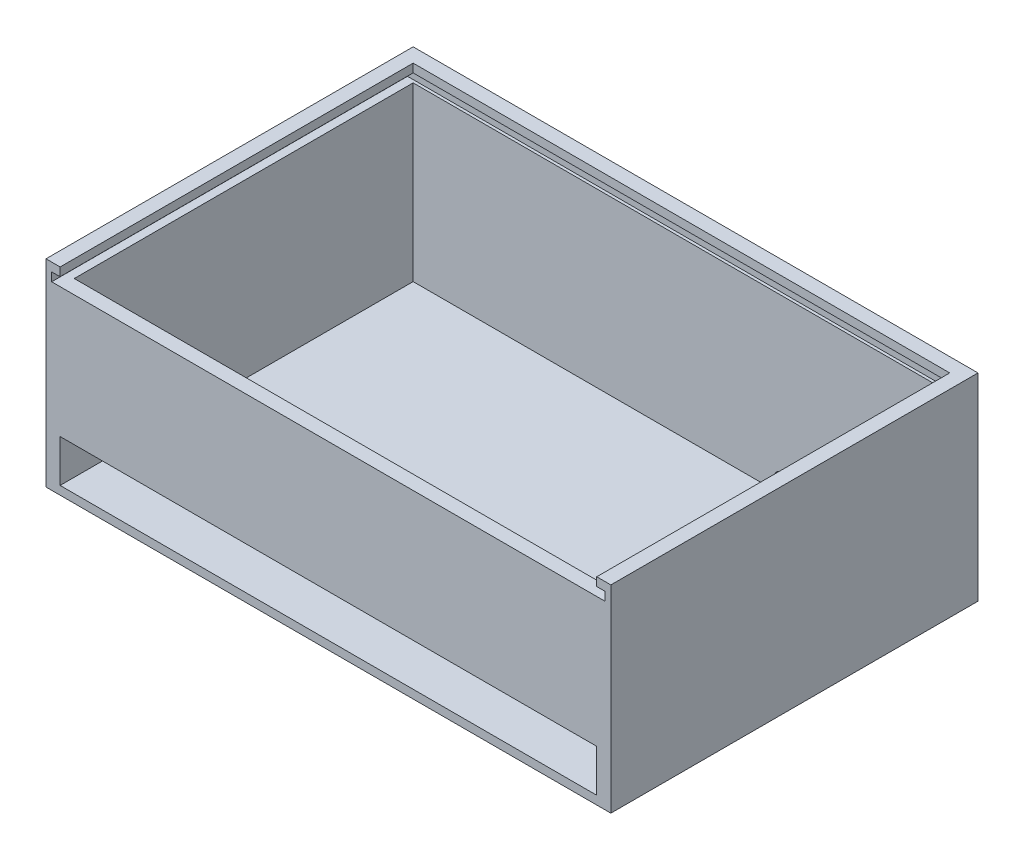
ISO-10303-21;
HEADER;
FILE_DESCRIPTION(('STEP AP214'),'2;1');
FILE_NAME('part.step','',(''),(''),'','','');
FILE_SCHEMA(('AUTOMOTIVE_DESIGN { 1 0 10303 214 1 1 1 1 }'));
ENDSEC;
DATA;
#1=APPLICATION_CONTEXT('core data for automotive mechanical design processes');
#2=APPLICATION_PROTOCOL_DEFINITION('international standard','automotive_design',2000,#1);
#3=PRODUCT_CONTEXT('',#1,'mechanical');
#4=PRODUCT('Part','Part','',(#3));
#5=PRODUCT_RELATED_PRODUCT_CATEGORY('part','',(#4));
#6=PRODUCT_DEFINITION_FORMATION('','',#4);
#7=PRODUCT_DEFINITION_CONTEXT('part definition',#1,'design');
#8=PRODUCT_DEFINITION('design','',#6,#7);
#9=PRODUCT_DEFINITION_SHAPE('','',#8);
#10=(LENGTH_UNIT() NAMED_UNIT(*) SI_UNIT(.MILLI.,.METRE.));
#11=(NAMED_UNIT(*) PLANE_ANGLE_UNIT() SI_UNIT($,.RADIAN.));
#12=(NAMED_UNIT(*) SI_UNIT($,.STERADIAN.) SOLID_ANGLE_UNIT());
#13=UNCERTAINTY_MEASURE_WITH_UNIT(LENGTH_MEASURE(1.E-05),#10,'distance_accuracy_value','');
#14=(GEOMETRIC_REPRESENTATION_CONTEXT(3) GLOBAL_UNCERTAINTY_ASSIGNED_CONTEXT((#13)) GLOBAL_UNIT_ASSIGNED_CONTEXT((#10,
#11,#12)) REPRESENTATION_CONTEXT('',''));
#15=CARTESIAN_POINT('',(0.,0.,0.));
#16=DIRECTION('',(0.,0.,1.));
#17=DIRECTION('',(1.,0.,0.));
#18=AXIS2_PLACEMENT_3D('',#15,#16,#17);
#19=CARTESIAN_POINT('',(-95.,70.,0.));
#20=DIRECTION('',(1.,0.,0.));
#21=DIRECTION('',(0.,0.,-1.));
#22=AXIS2_PLACEMENT_3D('',#19,#20,#21);
#23=PLANE('',#22);
#24=DIRECTION('',(0.,0.,1.));
#25=VECTOR('',#24,1.);
#26=CARTESIAN_POINT('',(-95.,67.,0.));
#27=LINE('',#26,#25);
#28=CARTESIAN_POINT('',(-95.,67.,-60.));
#29=VERTEX_POINT('',#28);
#30=CARTESIAN_POINT('',(-95.,67.,65.));
#31=VERTEX_POINT('',#30);
#32=EDGE_CURVE('E63',#29,#31,#27,.T.);
#33=ORIENTED_EDGE('',*,*,#32,.F.);
#34=DIRECTION('',(0.,-1.,0.));
#35=VECTOR('',#34,1.);
#36=CARTESIAN_POINT('',(-95.,70.,-60.));
#37=LINE('',#36,#35);
#38=CARTESIAN_POINT('',(-95.,70.,-60.));
#39=VERTEX_POINT('',#38);
#40=EDGE_CURVE('E312',#39,#29,#37,.T.);
#41=ORIENTED_EDGE('',*,*,#40,.F.);
#42=DIRECTION('',(0.,0.,1.));
#43=VECTOR('',#42,1.);
#44=CARTESIAN_POINT('',(-95.,70.,0.));
#45=LINE('',#44,#43);
#46=CARTESIAN_POINT('',(-95.,70.,65.));
#47=VERTEX_POINT('',#46);
#48=EDGE_CURVE('E283',#39,#47,#45,.T.);
#49=ORIENTED_EDGE('',*,*,#48,.T.);
#50=DIRECTION('',(0.,-1.,0.));
#51=VECTOR('',#50,1.);
#52=CARTESIAN_POINT('',(-95.,70.,65.));
#53=LINE('',#52,#51);
#54=EDGE_CURVE('E195',#47,#31,#53,.T.);
#55=ORIENTED_EDGE('',*,*,#54,.T.);
#56=EDGE_LOOP('',(#33,#41,#49,#55));
#57=FACE_BOUND('',#56,.T.);
#58=ADVANCED_FACE('F47',(#57),#23,.T.);
#59=CARTESIAN_POINT('',(0.,70.,-60.));
#60=DIRECTION('',(0.,0.,-1.));
#61=DIRECTION('',(-1.,0.,0.));
#62=AXIS2_PLACEMENT_3D('',#59,#60,#61);
#63=PLANE('',#62);
#64=ORIENTED_EDGE('',*,*,#40,.T.);
#65=DIRECTION('',(1.,0.,0.));
#66=VECTOR('',#65,1.);
#67=CARTESIAN_POINT('',(0.,67.,-60.));
#68=LINE('',#67,#66);
#69=CARTESIAN_POINT('',(95.,67.,-60.));
#70=VERTEX_POINT('',#69);
#71=EDGE_CURVE('E183',#29,#70,#68,.T.);
#72=ORIENTED_EDGE('',*,*,#71,.T.);
#73=DIRECTION('',(0.,-1.,0.));
#74=VECTOR('',#73,1.);
#75=CARTESIAN_POINT('',(95.,70.,-60.));
#76=LINE('',#75,#74);
#77=CARTESIAN_POINT('',(95.,70.,-60.));
#78=VERTEX_POINT('',#77);
#79=EDGE_CURVE('E179',#78,#70,#76,.T.);
#80=ORIENTED_EDGE('',*,*,#79,.F.);
#81=DIRECTION('',(1.,0.,0.));
#82=VECTOR('',#81,1.);
#83=CARTESIAN_POINT('',(0.,70.,-60.));
#84=LINE('',#83,#82);
#85=EDGE_CURVE('E286',#39,#78,#84,.T.);
#86=ORIENTED_EDGE('',*,*,#85,.F.);
#87=EDGE_LOOP('',(#64,#72,#80,#86));
#88=FACE_BOUND('',#87,.T.);
#89=ADVANCED_FACE('F402',(#88),#63,.F.);
#90=CARTESIAN_POINT('',(95.,70.,0.));
#91=DIRECTION('',(1.,0.,0.));
#92=DIRECTION('',(0.,0.,-1.));
#93=AXIS2_PLACEMENT_3D('',#90,#91,#92);
#94=PLANE('',#93);
#95=ORIENTED_EDGE('',*,*,#79,.T.);
#96=DIRECTION('',(0.,0.,1.));
#97=VECTOR('',#96,1.);
#98=CARTESIAN_POINT('',(95.,67.,0.));
#99=LINE('',#98,#97);
#100=CARTESIAN_POINT('',(95.,67.,65.));
#101=VERTEX_POINT('',#100);
#102=EDGE_CURVE('E173',#70,#101,#99,.T.);
#103=ORIENTED_EDGE('',*,*,#102,.T.);
#104=DIRECTION('',(0.,1.,0.));
#105=VECTOR('',#104,1.);
#106=CARTESIAN_POINT('',(95.,70.,65.));
#107=LINE('',#106,#105);
#108=CARTESIAN_POINT('',(95.,70.,65.));
#109=VERTEX_POINT('',#108);
#110=EDGE_CURVE('E176',#101,#109,#107,.T.);
#111=ORIENTED_EDGE('',*,*,#110,.T.);
#112=DIRECTION('',(0.,0.,1.));
#113=VECTOR('',#112,1.);
#114=CARTESIAN_POINT('',(95.,70.,0.));
#115=LINE('',#114,#113);
#116=EDGE_CURVE('E290',#78,#109,#115,.T.);
#117=ORIENTED_EDGE('',*,*,#116,.F.);
#118=EDGE_LOOP('',(#95,#103,#111,#117));
#119=FACE_BOUND('',#118,.T.);
#120=ADVANCED_FACE('F175',(#119),#94,.F.);
#121=CARTESIAN_POINT('',(100.,3.,-65.));
#122=DIRECTION('',(-1.,0.,0.));
#123=DIRECTION('',(0.,0.,1.));
#124=AXIS2_PLACEMENT_3D('',#121,#122,#123);
#125=PLANE('',#124);
#126=DIRECTION('',(0.,0.,-1.));
#127=VECTOR('',#126,1.);
#128=CARTESIAN_POINT('',(100.,0.,-65.));
#129=LINE('',#128,#127);
#130=CARTESIAN_POINT('',(100.,0.,65.));
#131=VERTEX_POINT('',#130);
#132=CARTESIAN_POINT('',(100.,0.,-65.));
#133=VERTEX_POINT('',#132);
#134=EDGE_CURVE('E316',#131,#133,#129,.T.);
#135=ORIENTED_EDGE('',*,*,#134,.T.);
#136=DIRECTION('',(0.,-1.,0.));
#137=VECTOR('',#136,1.);
#138=CARTESIAN_POINT('',(100.,3.,-65.));
#139=LINE('',#138,#137);
#140=CARTESIAN_POINT('',(100.,70.,-65.));
#141=VERTEX_POINT('',#140);
#142=EDGE_CURVE('E56',#141,#133,#139,.T.);
#143=ORIENTED_EDGE('',*,*,#142,.F.);
#144=DIRECTION('',(0.,0.,-1.));
#145=VECTOR('',#144,1.);
#146=CARTESIAN_POINT('',(100.,70.,0.));
#147=LINE('',#146,#145);
#148=CARTESIAN_POINT('',(100.,70.,65.));
#149=VERTEX_POINT('',#148);
#150=EDGE_CURVE('E271',#149,#141,#147,.T.);
#151=ORIENTED_EDGE('',*,*,#150,.F.);
#152=DIRECTION('',(0.,-1.,0.));
#153=VECTOR('',#152,1.);
#154=CARTESIAN_POINT('',(100.,3.,65.));
#155=LINE('',#154,#153);
#156=EDGE_CURVE('E329',#149,#131,#155,.T.);
#157=ORIENTED_EDGE('',*,*,#156,.T.);
#158=EDGE_LOOP('',(#135,#143,#151,#157));
#159=FACE_BOUND('',#158,.T.);
#160=ADVANCED_FACE('F49',(#159),#125,.F.);
#161=CARTESIAN_POINT('',(-100.,3.,-65.));
#162=DIRECTION('',(0.,0.,1.));
#163=DIRECTION('',(1.,0.,0.));
#164=AXIS2_PLACEMENT_3D('',#161,#162,#163);
#165=PLANE('',#164);
#166=CARTESIAN_POINT('',(35.,7.50000000000001,-65.));
#167=DIRECTION('',(0.,0.,-1.));
#168=DIRECTION('',(-1.,0.,0.));
#169=AXIS2_PLACEMENT_3D('',#166,#167,#168);
#170=CIRCLE('',#169,2.);
#171=CARTESIAN_POINT('',(33.,7.50000000000001,-65.));
#172=VERTEX_POINT('',#171);
#173=EDGE_CURVE('E469',#172,#172,#170,.T.);
#174=ORIENTED_EDGE('',*,*,#173,.F.);
#175=EDGE_LOOP('',(#174));
#176=FACE_BOUND('',#175,.T.);
#177=DIRECTION('',(-1.,0.,0.));
#178=VECTOR('',#177,1.);
#179=CARTESIAN_POINT('',(-100.,0.,-65.));
#180=LINE('',#179,#178);
#181=CARTESIAN_POINT('',(-100.,0.,-65.));
#182=VERTEX_POINT('',#181);
#183=EDGE_CURVE('E320',#133,#182,#180,.T.);
#184=ORIENTED_EDGE('',*,*,#183,.T.);
#185=DIRECTION('',(0.,-1.,0.));
#186=VECTOR('',#185,1.);
#187=CARTESIAN_POINT('',(-100.,3.,-65.));
#188=LINE('',#187,#186);
#189=CARTESIAN_POINT('',(-100.,70.,-65.));
#190=VERTEX_POINT('',#189);
#191=EDGE_CURVE('E337',#190,#182,#188,.T.);
#192=ORIENTED_EDGE('',*,*,#191,.F.);
#193=DIRECTION('',(-1.,0.,0.));
#194=VECTOR('',#193,1.);
#195=CARTESIAN_POINT('',(0.,70.,-65.));
#196=LINE('',#195,#194);
#197=EDGE_CURVE('E275',#141,#190,#196,.T.);
#198=ORIENTED_EDGE('',*,*,#197,.F.);
#199=ORIENTED_EDGE('',*,*,#142,.T.);
#200=EDGE_LOOP('',(#184,#192,#198,#199));
#201=FACE_BOUND('',#200,.T.);
#202=ADVANCED_FACE('F344',(#176,#201),#165,.F.);
#203=CARTESIAN_POINT('',(-100.,3.,-65.));
#204=DIRECTION('',(1.,0.,0.));
#205=DIRECTION('',(0.,0.,-1.));
#206=AXIS2_PLACEMENT_3D('',#203,#204,#205);
#207=PLANE('',#206);
#208=DIRECTION('',(0.,0.,1.));
#209=VECTOR('',#208,1.);
#210=CARTESIAN_POINT('',(-100.,0.,-65.));
#211=LINE('',#210,#209);
#212=CARTESIAN_POINT('',(-100.,0.,65.));
#213=VERTEX_POINT('',#212);
#214=EDGE_CURVE('E323',#182,#213,#211,.T.);
#215=ORIENTED_EDGE('',*,*,#214,.T.);
#216=DIRECTION('',(0.,-1.,0.));
#217=VECTOR('',#216,1.);
#218=CARTESIAN_POINT('',(-100.,3.,65.));
#219=LINE('',#218,#217);
#220=CARTESIAN_POINT('',(-100.,70.,65.));
#221=VERTEX_POINT('',#220);
#222=EDGE_CURVE('E333',#221,#213,#219,.T.);
#223=ORIENTED_EDGE('',*,*,#222,.F.);
#224=DIRECTION('',(0.,0.,1.));
#225=VECTOR('',#224,1.);
#226=CARTESIAN_POINT('',(-100.,70.,0.));
#227=LINE('',#226,#225);
#228=EDGE_CURVE('E279',#190,#221,#227,.T.);
#229=ORIENTED_EDGE('',*,*,#228,.F.);
#230=ORIENTED_EDGE('',*,*,#191,.T.);
#231=EDGE_LOOP('',(#215,#223,#229,#230));
#232=FACE_BOUND('',#231,.T.);
#233=ADVANCED_FACE('F353',(#232),#207,.F.);
#234=CARTESIAN_POINT('',(-100.,3.,65.));
#235=DIRECTION('',(0.,0.,-1.));
#236=DIRECTION('',(-1.,0.,0.));
#237=AXIS2_PLACEMENT_3D('',#234,#235,#236);
#238=PLANE('',#237);
#239=DIRECTION('',(1.,0.,0.));
#240=VECTOR('',#239,1.);
#241=CARTESIAN_POINT('',(0.,70.,65.));
#242=LINE('',#241,#240);
#243=EDGE_CURVE('E193',#109,#149,#242,.T.);
#244=ORIENTED_EDGE('',*,*,#243,.F.);
#245=ORIENTED_EDGE('',*,*,#110,.F.);
#246=DIRECTION('',(-1.,0.,0.));
#247=VECTOR('',#246,1.);
#248=CARTESIAN_POINT('',(-98.,67.,65.));
#249=LINE('',#248,#247);
#250=CARTESIAN_POINT('',(98.,67.,65.));
#251=VERTEX_POINT('',#250);
#252=EDGE_CURVE('E191',#251,#101,#249,.T.);
#253=ORIENTED_EDGE('',*,*,#252,.F.);
#254=DIRECTION('',(0.,1.,0.));
#255=VECTOR('',#254,1.);
#256=CARTESIAN_POINT('',(98.,67.,65.));
#257=LINE('',#256,#255);
#258=CARTESIAN_POINT('',(98.,63.95,65.));
#259=VERTEX_POINT('',#258);
#260=EDGE_CURVE('E210',#259,#251,#257,.T.);
#261=ORIENTED_EDGE('',*,*,#260,.F.);
#262=DIRECTION('',(1.,0.,0.));
#263=VECTOR('',#262,1.);
#264=CARTESIAN_POINT('',(-98.,63.95,65.));
#265=LINE('',#264,#263);
#266=CARTESIAN_POINT('',(-98.,63.95,65.));
#267=VERTEX_POINT('',#266);
#268=EDGE_CURVE('E376',#267,#259,#265,.T.);
#269=ORIENTED_EDGE('',*,*,#268,.F.);
#270=DIRECTION('',(0.,-1.,0.));
#271=VECTOR('',#270,1.);
#272=CARTESIAN_POINT('',(-98.,67.,65.));
#273=LINE('',#272,#271);
#274=CARTESIAN_POINT('',(-98.,67.,65.));
#275=VERTEX_POINT('',#274);
#276=EDGE_CURVE('E71',#275,#267,#273,.T.);
#277=ORIENTED_EDGE('',*,*,#276,.F.);
#278=EDGE_CURVE('E203',#31,#275,#249,.T.);
#279=ORIENTED_EDGE('',*,*,#278,.F.);
#280=ORIENTED_EDGE('',*,*,#54,.F.);
#281=EDGE_CURVE('E267',#221,#47,#242,.T.);
#282=ORIENTED_EDGE('',*,*,#281,.F.);
#283=ORIENTED_EDGE('',*,*,#222,.T.);
#284=DIRECTION('',(1.,0.,0.));
#285=VECTOR('',#284,1.);
#286=CARTESIAN_POINT('',(-100.,0.,65.));
#287=LINE('',#286,#285);
#288=EDGE_CURVE('E326',#213,#131,#287,.T.);
#289=ORIENTED_EDGE('',*,*,#288,.T.);
#290=ORIENTED_EDGE('',*,*,#156,.F.);
#291=EDGE_LOOP('',(#244,#245,#253,#261,#269,#277,#279,#280,#282,#283,#289,#290));
#292=FACE_BOUND('',#291,.T.);
#293=DIRECTION('',(0.,1.,0.));
#294=VECTOR('',#293,1.);
#295=CARTESIAN_POINT('',(95.,3.,65.));
#296=LINE('',#295,#294);
#297=CARTESIAN_POINT('',(95.,3.,65.));
#298=VERTEX_POINT('',#297);
#299=CARTESIAN_POINT('',(95.,18.,65.));
#300=VERTEX_POINT('',#299);
#301=EDGE_CURVE('E245',#298,#300,#296,.T.);
#302=ORIENTED_EDGE('',*,*,#301,.F.);
#303=DIRECTION('',(1.,0.,0.));
#304=VECTOR('',#303,1.);
#305=CARTESIAN_POINT('',(-95.,3.,65.));
#306=LINE('',#305,#304);
#307=CARTESIAN_POINT('',(-95.,3.,65.));
#308=VERTEX_POINT('',#307);
#309=EDGE_CURVE('E249',#308,#298,#306,.T.);
#310=ORIENTED_EDGE('',*,*,#309,.F.);
#311=DIRECTION('',(0.,-1.,0.));
#312=VECTOR('',#311,1.);
#313=CARTESIAN_POINT('',(-95.,3.,65.));
#314=LINE('',#313,#312);
#315=CARTESIAN_POINT('',(-95.,18.,65.));
#316=VERTEX_POINT('',#315);
#317=EDGE_CURVE('E240',#316,#308,#314,.T.);
#318=ORIENTED_EDGE('',*,*,#317,.F.);
#319=DIRECTION('',(-1.,0.,0.));
#320=VECTOR('',#319,1.);
#321=CARTESIAN_POINT('',(-95.,18.,65.));
#322=LINE('',#321,#320);
#323=EDGE_CURVE('E241',#300,#316,#322,.T.);
#324=ORIENTED_EDGE('',*,*,#323,.F.);
#325=EDGE_LOOP('',(#302,#310,#318,#324));
#326=FACE_BOUND('',#325,.T.);
#327=ADVANCED_FACE('F188',(#292,#326),#238,.F.);
#328=CARTESIAN_POINT('',(0.,0.,0.));
#329=DIRECTION('',(0.,1.,0.));
#330=DIRECTION('',(0.,0.,1.));
#331=AXIS2_PLACEMENT_3D('',#328,#329,#330);
#332=PLANE('',#331);
#333=ORIENTED_EDGE('',*,*,#134,.F.);
#334=ORIENTED_EDGE('',*,*,#288,.F.);
#335=ORIENTED_EDGE('',*,*,#214,.F.);
#336=ORIENTED_EDGE('',*,*,#183,.F.);
#337=EDGE_LOOP('',(#333,#334,#335,#336));
#338=FACE_BOUND('',#337,.T.);
#339=ADVANCED_FACE('F350',(#338),#332,.F.);
#340=DIRECTION('',(0.,0.,-1.));
#341=VECTOR('',#340,1.);
#342=CARTESIAN_POINT('',(-95.,63.95,0.));
#343=LINE('',#342,#341);
#344=CARTESIAN_POINT('',(-95.,63.95,60.));
#345=VERTEX_POINT('',#344);
#346=CARTESIAN_POINT('',(-95.,63.95,-60.));
#347=VERTEX_POINT('',#346);
#348=EDGE_CURVE('E184',#345,#347,#343,.T.);
#349=ORIENTED_EDGE('',*,*,#348,.F.);
#350=DIRECTION('',(0.,-1.,0.));
#351=VECTOR('',#350,1.);
#352=CARTESIAN_POINT('',(-95.,70.,60.));
#353=LINE('',#352,#351);
#354=CARTESIAN_POINT('',(-95.,18.,60.));
#355=VERTEX_POINT('',#354);
#356=EDGE_CURVE('E293',#345,#355,#353,.T.);
#357=ORIENTED_EDGE('',*,*,#356,.T.);
#358=DIRECTION('',(0.,0.,1.));
#359=VECTOR('',#358,1.);
#360=CARTESIAN_POINT('',(-95.,18.,-130.591185525459));
#361=LINE('',#360,#359);
#362=EDGE_CURVE('E260',#355,#316,#361,.T.);
#363=ORIENTED_EDGE('',*,*,#362,.T.);
#364=ORIENTED_EDGE('',*,*,#317,.T.);
#365=DIRECTION('',(0.,0.,1.));
#366=VECTOR('',#365,1.);
#367=CARTESIAN_POINT('',(-95.,3.,0.));
#368=LINE('',#367,#366);
#369=CARTESIAN_POINT('',(-95.,3.,-60.));
#370=VERTEX_POINT('',#369);
#371=EDGE_CURVE('E264',#370,#308,#368,.T.);
#372=ORIENTED_EDGE('',*,*,#371,.F.);
#373=EDGE_CURVE('E311',#347,#370,#37,.T.);
#374=ORIENTED_EDGE('',*,*,#373,.F.);
#375=EDGE_LOOP('',(#349,#357,#363,#364,#372,#374));
#376=FACE_BOUND('',#375,.T.);
#377=ADVANCED_FACE('F405',(#376),#23,.T.);
#378=CARTESIAN_POINT('',(35.,7.50000000000001,-60.));
#379=DIRECTION('',(0.,0.,-1.));
#380=DIRECTION('',(-1.,0.,0.));
#381=AXIS2_PLACEMENT_3D('',#378,#379,#380);
#382=CIRCLE('',#381,2.);
#383=CARTESIAN_POINT('',(33.,7.50000000000001,-60.));
#384=VERTEX_POINT('',#383);
#385=EDGE_CURVE('E472',#384,#384,#382,.F.);
#386=ORIENTED_EDGE('',*,*,#385,.F.);
#387=EDGE_LOOP('',(#386));
#388=FACE_BOUND('',#387,.T.);
#389=CARTESIAN_POINT('',(95.,63.95,-60.));
#390=VERTEX_POINT('',#389);
#391=CARTESIAN_POINT('',(95.,3.,-60.));
#392=VERTEX_POINT('',#391);
#393=EDGE_CURVE('E308',#390,#392,#76,.T.);
#394=ORIENTED_EDGE('',*,*,#393,.F.);
#395=DIRECTION('',(-1.,0.,0.));
#396=VECTOR('',#395,1.);
#397=CARTESIAN_POINT('',(0.,63.95,-60.));
#398=LINE('',#397,#396);
#399=EDGE_CURVE('E230',#390,#347,#398,.T.);
#400=ORIENTED_EDGE('',*,*,#399,.T.);
#401=ORIENTED_EDGE('',*,*,#373,.T.);
#402=DIRECTION('',(1.,0.,0.));
#403=VECTOR('',#402,1.);
#404=CARTESIAN_POINT('',(0.,3.,-60.));
#405=LINE('',#404,#403);
#406=EDGE_CURVE('E296',#370,#392,#405,.T.);
#407=ORIENTED_EDGE('',*,*,#406,.T.);
#408=EDGE_LOOP('',(#394,#400,#401,#407));
#409=FACE_BOUND('',#408,.T.);
#410=ADVANCED_FACE('F412',(#388,#409),#63,.F.);
#411=DIRECTION('',(0.,-1.,0.));
#412=VECTOR('',#411,1.);
#413=CARTESIAN_POINT('',(95.,70.,60.));
#414=LINE('',#413,#412);
#415=CARTESIAN_POINT('',(95.,63.95,60.));
#416=VERTEX_POINT('',#415);
#417=CARTESIAN_POINT('',(95.,18.,60.));
#418=VERTEX_POINT('',#417);
#419=EDGE_CURVE('E305',#416,#418,#414,.T.);
#420=ORIENTED_EDGE('',*,*,#419,.F.);
#421=DIRECTION('',(0.,0.,-1.));
#422=VECTOR('',#421,1.);
#423=CARTESIAN_POINT('',(95.,63.95,0.));
#424=LINE('',#423,#422);
#425=EDGE_CURVE('E217',#416,#390,#424,.T.);
#426=ORIENTED_EDGE('',*,*,#425,.T.);
#427=ORIENTED_EDGE('',*,*,#393,.T.);
#428=DIRECTION('',(0.,0.,1.));
#429=VECTOR('',#428,1.);
#430=CARTESIAN_POINT('',(95.,3.,0.));
#431=LINE('',#430,#429);
#432=EDGE_CURVE('E300',#392,#298,#431,.T.);
#433=ORIENTED_EDGE('',*,*,#432,.T.);
#434=ORIENTED_EDGE('',*,*,#301,.T.);
#435=DIRECTION('',(0.,0.,1.));
#436=VECTOR('',#435,1.);
#437=CARTESIAN_POINT('',(95.,18.,-130.591185525459));
#438=LINE('',#437,#436);
#439=EDGE_CURVE('E244',#418,#300,#438,.T.);
#440=ORIENTED_EDGE('',*,*,#439,.F.);
#441=EDGE_LOOP('',(#420,#426,#427,#433,#434,#440));
#442=FACE_BOUND('',#441,.T.);
#443=ADVANCED_FACE('F420',(#442),#94,.F.);
#444=CARTESIAN_POINT('',(0.,70.,60.));
#445=DIRECTION('',(0.,0.,-1.));
#446=DIRECTION('',(-1.,0.,0.));
#447=AXIS2_PLACEMENT_3D('',#444,#445,#446);
#448=PLANE('',#447);
#449=DIRECTION('',(-1.,0.,0.));
#450=VECTOR('',#449,1.);
#451=CARTESIAN_POINT('',(0.,63.95,60.));
#452=LINE('',#451,#450);
#453=EDGE_CURVE('E11',#416,#345,#452,.T.);
#454=ORIENTED_EDGE('',*,*,#453,.F.);
#455=ORIENTED_EDGE('',*,*,#419,.T.);
#456=DIRECTION('',(-1.,0.,0.));
#457=VECTOR('',#456,1.);
#458=CARTESIAN_POINT('',(-95.,18.,60.));
#459=LINE('',#458,#457);
#460=EDGE_CURVE('E256',#418,#355,#459,.T.);
#461=ORIENTED_EDGE('',*,*,#460,.T.);
#462=ORIENTED_EDGE('',*,*,#356,.F.);
#463=EDGE_LOOP('',(#454,#455,#461,#462));
#464=FACE_BOUND('',#463,.T.);
#465=ADVANCED_FACE('F431',(#464),#448,.T.);
#466=CARTESIAN_POINT('',(0.,70.,0.));
#467=DIRECTION('',(0.,1.,0.));
#468=DIRECTION('',(0.,0.,1.));
#469=AXIS2_PLACEMENT_3D('',#466,#467,#468);
#470=PLANE('',#469);
#471=ORIENTED_EDGE('',*,*,#116,.T.);
#472=ORIENTED_EDGE('',*,*,#243,.T.);
#473=ORIENTED_EDGE('',*,*,#150,.T.);
#474=ORIENTED_EDGE('',*,*,#197,.T.);
#475=ORIENTED_EDGE('',*,*,#228,.T.);
#476=ORIENTED_EDGE('',*,*,#281,.T.);
#477=ORIENTED_EDGE('',*,*,#48,.F.);
#478=ORIENTED_EDGE('',*,*,#85,.T.);
#479=EDGE_LOOP('',(#471,#472,#473,#474,#475,#476,#477,#478));
#480=FACE_BOUND('',#479,.T.);
#481=ADVANCED_FACE('F360',(#480),#470,.T.);
#482=CARTESIAN_POINT('',(0.,3.,0.));
#483=DIRECTION('',(0.,1.,0.));
#484=DIRECTION('',(0.,0.,1.));
#485=AXIS2_PLACEMENT_3D('',#482,#483,#484);
#486=PLANE('',#485);
#487=ORIENTED_EDGE('',*,*,#371,.T.);
#488=ORIENTED_EDGE('',*,*,#309,.T.);
#489=ORIENTED_EDGE('',*,*,#432,.F.);
#490=ORIENTED_EDGE('',*,*,#406,.F.);
#491=EDGE_LOOP('',(#487,#488,#489,#490));
#492=FACE_BOUND('',#491,.T.);
#493=ADVANCED_FACE('F444',(#492),#486,.T.);
#494=CARTESIAN_POINT('',(-95.,18.,-130.591185525459));
#495=DIRECTION('',(0.,1.,0.));
#496=DIRECTION('',(0.,0.,1.));
#497=AXIS2_PLACEMENT_3D('',#494,#495,#496);
#498=PLANE('',#497);
#499=ORIENTED_EDGE('',*,*,#439,.T.);
#500=ORIENTED_EDGE('',*,*,#323,.T.);
#501=ORIENTED_EDGE('',*,*,#362,.F.);
#502=ORIENTED_EDGE('',*,*,#460,.F.);
#503=EDGE_LOOP('',(#499,#500,#501,#502));
#504=FACE_BOUND('',#503,.T.);
#505=ADVANCED_FACE('F436',(#504),#498,.F.);
#506=CARTESIAN_POINT('',(-98.,67.,-61.));
#507=DIRECTION('',(-1.,0.,0.));
#508=DIRECTION('',(0.,0.,1.));
#509=AXIS2_PLACEMENT_3D('',#506,#507,#508);
#510=PLANE('',#509);
#511=ORIENTED_EDGE('',*,*,#276,.T.);
#512=DIRECTION('',(0.,0.,1.));
#513=VECTOR('',#512,1.);
#514=CARTESIAN_POINT('',(-98.,63.95,-61.));
#515=LINE('',#514,#513);
#516=CARTESIAN_POINT('',(-98.,63.95,-61.));
#517=VERTEX_POINT('',#516);
#518=EDGE_CURVE('E223',#517,#267,#515,.T.);
#519=ORIENTED_EDGE('',*,*,#518,.F.);
#520=DIRECTION('',(0.,-1.,0.));
#521=VECTOR('',#520,1.);
#522=CARTESIAN_POINT('',(-98.,67.,-61.));
#523=LINE('',#522,#521);
#524=CARTESIAN_POINT('',(-98.,67.,-61.));
#525=VERTEX_POINT('',#524);
#526=EDGE_CURVE('E202',#525,#517,#523,.T.);
#527=ORIENTED_EDGE('',*,*,#526,.F.);
#528=DIRECTION('',(0.,0.,1.));
#529=VECTOR('',#528,1.);
#530=CARTESIAN_POINT('',(-98.,67.,-61.));
#531=LINE('',#530,#529);
#532=EDGE_CURVE('E214',#525,#275,#531,.T.);
#533=ORIENTED_EDGE('',*,*,#532,.T.);
#534=EDGE_LOOP('',(#511,#519,#527,#533));
#535=FACE_BOUND('',#534,.T.);
#536=ADVANCED_FACE('F386',(#535),#510,.F.);
#537=CARTESIAN_POINT('',(-98.,67.,-61.));
#538=DIRECTION('',(0.,1.,0.));
#539=DIRECTION('',(0.,0.,1.));
#540=AXIS2_PLACEMENT_3D('',#537,#538,#539);
#541=PLANE('',#540);
#542=ORIENTED_EDGE('',*,*,#252,.T.);
#543=ORIENTED_EDGE('',*,*,#102,.F.);
#544=ORIENTED_EDGE('',*,*,#71,.F.);
#545=ORIENTED_EDGE('',*,*,#32,.T.);
#546=ORIENTED_EDGE('',*,*,#278,.T.);
#547=ORIENTED_EDGE('',*,*,#532,.F.);
#548=DIRECTION('',(-1.,0.,0.));
#549=VECTOR('',#548,1.);
#550=CARTESIAN_POINT('',(-98.,67.,-61.));
#551=LINE('',#550,#549);
#552=CARTESIAN_POINT('',(98.,67.,-61.));
#553=VERTEX_POINT('',#552);
#554=EDGE_CURVE('E226',#553,#525,#551,.T.);
#555=ORIENTED_EDGE('',*,*,#554,.F.);
#556=DIRECTION('',(0.,0.,1.));
#557=VECTOR('',#556,1.);
#558=CARTESIAN_POINT('',(98.,67.,-61.));
#559=LINE('',#558,#557);
#560=EDGE_CURVE('E199',#553,#251,#559,.T.);
#561=ORIENTED_EDGE('',*,*,#560,.T.);
#562=EDGE_LOOP('',(#542,#543,#544,#545,#546,#547,#555,#561));
#563=FACE_BOUND('',#562,.T.);
#564=ADVANCED_FACE('F197',(#563),#541,.F.);
#565=CARTESIAN_POINT('',(98.,67.,-61.));
#566=DIRECTION('',(1.,0.,0.));
#567=DIRECTION('',(0.,0.,-1.));
#568=AXIS2_PLACEMENT_3D('',#565,#566,#567);
#569=PLANE('',#568);
#570=ORIENTED_EDGE('',*,*,#260,.T.);
#571=ORIENTED_EDGE('',*,*,#560,.F.);
#572=DIRECTION('',(0.,1.,0.));
#573=VECTOR('',#572,1.);
#574=CARTESIAN_POINT('',(98.,67.,-61.));
#575=LINE('',#574,#573);
#576=CARTESIAN_POINT('',(98.,63.95,-61.));
#577=VERTEX_POINT('',#576);
#578=EDGE_CURVE('E365',#577,#553,#575,.T.);
#579=ORIENTED_EDGE('',*,*,#578,.F.);
#580=DIRECTION('',(0.,0.,1.));
#581=VECTOR('',#580,1.);
#582=CARTESIAN_POINT('',(98.,63.95,-61.));
#583=LINE('',#582,#581);
#584=EDGE_CURVE('E220',#577,#259,#583,.T.);
#585=ORIENTED_EDGE('',*,*,#584,.T.);
#586=EDGE_LOOP('',(#570,#571,#579,#585));
#587=FACE_BOUND('',#586,.T.);
#588=ADVANCED_FACE('F383',(#587),#569,.F.);
#589=CARTESIAN_POINT('',(-98.,63.95,-61.));
#590=DIRECTION('',(0.,-1.,0.));
#591=DIRECTION('',(0.,0.,-1.));
#592=AXIS2_PLACEMENT_3D('',#589,#590,#591);
#593=PLANE('',#592);
#594=ORIENTED_EDGE('',*,*,#348,.T.);
#595=ORIENTED_EDGE('',*,*,#399,.F.);
#596=ORIENTED_EDGE('',*,*,#425,.F.);
#597=ORIENTED_EDGE('',*,*,#453,.T.);
#598=EDGE_LOOP('',(#594,#595,#596,#597));
#599=FACE_BOUND('',#598,.T.);
#600=ORIENTED_EDGE('',*,*,#268,.T.);
#601=ORIENTED_EDGE('',*,*,#584,.F.);
#602=DIRECTION('',(1.,0.,0.));
#603=VECTOR('',#602,1.);
#604=CARTESIAN_POINT('',(-98.,63.95,-61.));
#605=LINE('',#604,#603);
#606=EDGE_CURVE('E208',#517,#577,#605,.T.);
#607=ORIENTED_EDGE('',*,*,#606,.F.);
#608=ORIENTED_EDGE('',*,*,#518,.T.);
#609=EDGE_LOOP('',(#600,#601,#607,#608));
#610=FACE_BOUND('',#609,.T.);
#611=ADVANCED_FACE('F390',(#599,#610),#593,.F.);
#612=CARTESIAN_POINT('',(0.,0.,-61.));
#613=DIRECTION('',(0.,0.,1.));
#614=DIRECTION('',(1.,0.,0.));
#615=AXIS2_PLACEMENT_3D('',#612,#613,#614);
#616=PLANE('',#615);
#617=ORIENTED_EDGE('',*,*,#526,.T.);
#618=ORIENTED_EDGE('',*,*,#606,.T.);
#619=ORIENTED_EDGE('',*,*,#578,.T.);
#620=ORIENTED_EDGE('',*,*,#554,.T.);
#621=EDGE_LOOP('',(#617,#618,#619,#620));
#622=FACE_BOUND('',#621,.T.);
#623=ADVANCED_FACE('F387',(#622),#616,.T.);
#624=CARTESIAN_POINT('',(35.,7.50000000000001,-54.3431457505076));
#625=DIRECTION('',(0.,0.,-1.));
#626=DIRECTION('',(-1.,0.,0.));
#627=AXIS2_PLACEMENT_3D('',#624,#625,#626);
#628=CYLINDRICAL_SURFACE('',#627,2.);
#629=ORIENTED_EDGE('',*,*,#385,.T.);
#630=EDGE_LOOP('',(#629));
#631=FACE_BOUND('',#630,.T.);
#632=ORIENTED_EDGE('',*,*,#173,.T.);
#633=EDGE_LOOP('',(#632));
#634=FACE_BOUND('',#633,.T.);
#635=ADVANCED_FACE('F389',(#631,#634),#628,.F.);
#636=CLOSED_SHELL('',(#58,#89,#120,#160,#202,#233,#327,#339,#377,#410,#443,#465,#481,#493,#505,
#536,#564,#588,#611,#623,#635));
#637=MANIFOLD_SOLID_BREP('B2',#636);
#638=ADVANCED_BREP_SHAPE_REPRESENTATION('',(#18,#637),#14);
#639=SHAPE_DEFINITION_REPRESENTATION(#9,#638);
ENDSEC;
END-ISO-10303-21;
